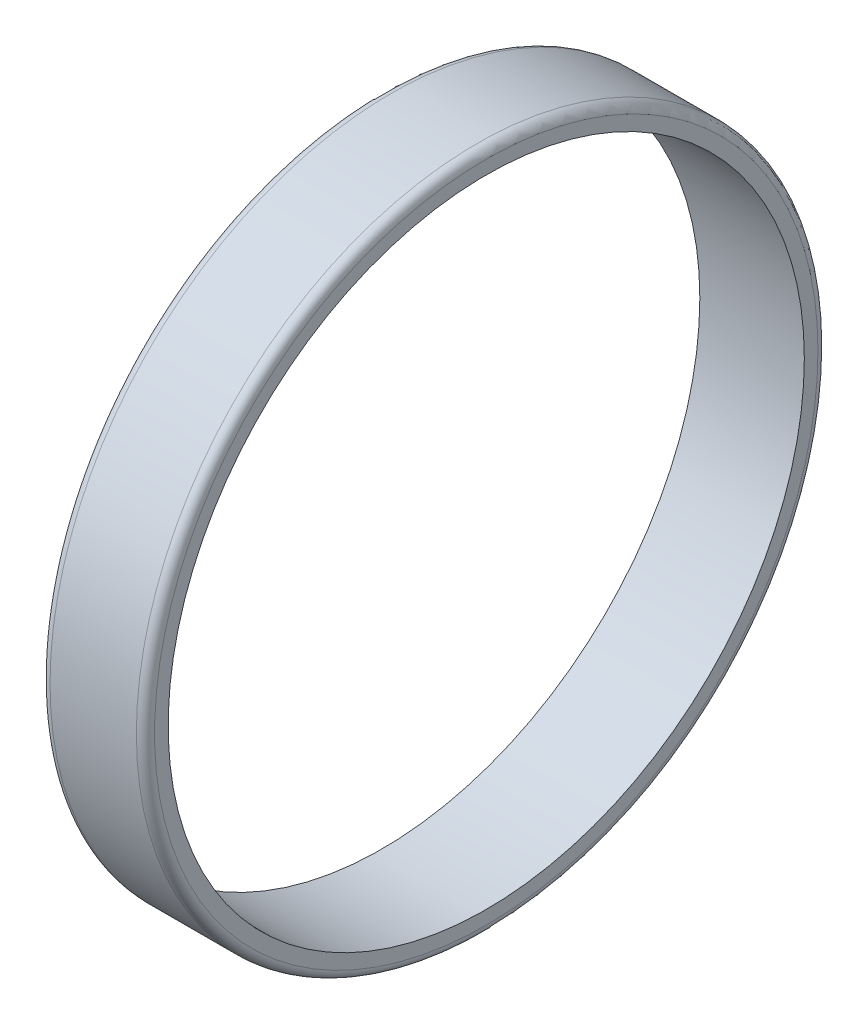
ISO-10303-21;
HEADER;
FILE_DESCRIPTION(('STEP AP214'),'2;1');
FILE_NAME('part.step','',(''),(''),'','','');
FILE_SCHEMA(('AUTOMOTIVE_DESIGN { 1 0 10303 214 1 1 1 1 }'));
ENDSEC;
DATA;
#1=APPLICATION_CONTEXT('core data for automotive mechanical design processes');
#2=APPLICATION_PROTOCOL_DEFINITION('international standard','automotive_design',2000,#1);
#3=PRODUCT_CONTEXT('',#1,'mechanical');
#4=PRODUCT('Part','Part','',(#3));
#5=PRODUCT_RELATED_PRODUCT_CATEGORY('part','',(#4));
#6=PRODUCT_DEFINITION_FORMATION('','',#4);
#7=PRODUCT_DEFINITION_CONTEXT('part definition',#1,'design');
#8=PRODUCT_DEFINITION('design','',#6,#7);
#9=PRODUCT_DEFINITION_SHAPE('','',#8);
#10=(LENGTH_UNIT() NAMED_UNIT(*) SI_UNIT(.MILLI.,.METRE.));
#11=(NAMED_UNIT(*) PLANE_ANGLE_UNIT() SI_UNIT($,.RADIAN.));
#12=(NAMED_UNIT(*) SI_UNIT($,.STERADIAN.) SOLID_ANGLE_UNIT());
#13=UNCERTAINTY_MEASURE_WITH_UNIT(LENGTH_MEASURE(1.E-05),#10,'distance_accuracy_value','');
#14=(GEOMETRIC_REPRESENTATION_CONTEXT(3) GLOBAL_UNCERTAINTY_ASSIGNED_CONTEXT((#13)) GLOBAL_UNIT_ASSIGNED_CONTEXT((#10,
#11,#12)) REPRESENTATION_CONTEXT('',''));
#15=CARTESIAN_POINT('',(0.,0.,0.));
#16=DIRECTION('',(0.,0.,1.));
#17=DIRECTION('',(1.,0.,0.));
#18=AXIS2_PLACEMENT_3D('',#15,#16,#17);
#19=CARTESIAN_POINT('',(11.5,0.,0.));
#20=DIRECTION('',(1.,0.,0.));
#21=DIRECTION('',(0.,0.,-1.));
#22=AXIS2_PLACEMENT_3D('',#19,#20,#21);
#23=PLANE('',#22);
#24=CARTESIAN_POINT('',(11.5,0.,0.));
#25=DIRECTION('',(1.,0.,0.));
#26=DIRECTION('',(0.,0.,-1.));
#27=AXIS2_PLACEMENT_3D('',#24,#25,#26);
#28=CIRCLE('',#27,36.5);
#29=CARTESIAN_POINT('',(11.5,0.,-36.5));
#30=VERTEX_POINT('',#29);
#31=EDGE_CURVE('E10',#30,#30,#28,.T.);
#32=ORIENTED_EDGE('',*,*,#31,.T.);
#33=EDGE_LOOP('',(#32));
#34=FACE_BOUND('',#33,.T.);
#35=CARTESIAN_POINT('',(11.5,0.,0.));
#36=DIRECTION('',(1.,0.,0.));
#37=DIRECTION('',(0.,0.,-1.));
#38=AXIS2_PLACEMENT_3D('',#35,#36,#37);
#39=CIRCLE('',#38,35.);
#40=CARTESIAN_POINT('',(11.5,0.,-35.));
#41=VERTEX_POINT('',#40);
#42=EDGE_CURVE('E53',#41,#41,#39,.T.);
#43=ORIENTED_EDGE('',*,*,#42,.F.);
#44=EDGE_LOOP('',(#43));
#45=FACE_BOUND('',#44,.T.);
#46=ADVANCED_FACE('F33',(#34,#45),#23,.T.);
#47=CARTESIAN_POINT('',(0.,0.,0.));
#48=DIRECTION('',(1.,0.,0.));
#49=DIRECTION('',(0.,0.,-1.));
#50=AXIS2_PLACEMENT_3D('',#47,#48,#49);
#51=PLANE('',#50);
#52=CARTESIAN_POINT('',(0.,0.,0.));
#53=DIRECTION('',(1.,0.,0.));
#54=DIRECTION('',(0.,0.,-1.));
#55=AXIS2_PLACEMENT_3D('',#52,#53,#54);
#56=CIRCLE('',#55,36.5);
#57=CARTESIAN_POINT('',(0.,0.,-36.5));
#58=VERTEX_POINT('',#57);
#59=EDGE_CURVE('E40',#58,#58,#56,.F.);
#60=ORIENTED_EDGE('',*,*,#59,.T.);
#61=EDGE_LOOP('',(#60));
#62=FACE_BOUND('',#61,.T.);
#63=CARTESIAN_POINT('',(0.,0.,0.));
#64=DIRECTION('',(1.,0.,0.));
#65=DIRECTION('',(0.,0.,-1.));
#66=AXIS2_PLACEMENT_3D('',#63,#64,#65);
#67=CIRCLE('',#66,35.);
#68=CARTESIAN_POINT('',(0.,0.,-35.));
#69=VERTEX_POINT('',#68);
#70=EDGE_CURVE('E54',#69,#69,#67,.T.);
#71=ORIENTED_EDGE('',*,*,#70,.T.);
#72=EDGE_LOOP('',(#71));
#73=FACE_BOUND('',#72,.T.);
#74=ADVANCED_FACE('F64',(#62,#73),#51,.F.);
#75=CARTESIAN_POINT('',(11.5,0.,0.));
#76=DIRECTION('',(-1.,0.,0.));
#77=DIRECTION('',(0.,0.,1.));
#78=AXIS2_PLACEMENT_3D('',#75,#76,#77);
#79=CYLINDRICAL_SURFACE('',#78,37.5);
#80=CARTESIAN_POINT('',(1.,0.,0.));
#81=DIRECTION('',(1.,0.,0.));
#82=DIRECTION('',(0.,0.,-1.));
#83=AXIS2_PLACEMENT_3D('',#80,#81,#82);
#84=CIRCLE('',#83,37.5);
#85=CARTESIAN_POINT('',(1.,0.,-37.5));
#86=VERTEX_POINT('',#85);
#87=EDGE_CURVE('E44',#86,#86,#84,.T.);
#88=ORIENTED_EDGE('',*,*,#87,.T.);
#89=EDGE_LOOP('',(#88));
#90=FACE_BOUND('',#89,.T.);
#91=CARTESIAN_POINT('',(10.5,0.,0.));
#92=DIRECTION('',(1.,0.,0.));
#93=DIRECTION('',(0.,0.,-1.));
#94=AXIS2_PLACEMENT_3D('',#91,#92,#93);
#95=CIRCLE('',#94,37.5);
#96=CARTESIAN_POINT('',(10.5,0.,-37.5));
#97=VERTEX_POINT('',#96);
#98=EDGE_CURVE('E48',#97,#97,#95,.F.);
#99=ORIENTED_EDGE('',*,*,#98,.T.);
#100=EDGE_LOOP('',(#99));
#101=FACE_BOUND('',#100,.T.);
#102=ADVANCED_FACE('F69',(#90,#101),#79,.T.);
#103=CARTESIAN_POINT('',(11.5,0.,0.));
#104=DIRECTION('',(-1.,0.,0.));
#105=DIRECTION('',(0.,0.,1.));
#106=AXIS2_PLACEMENT_3D('',#103,#104,#105);
#107=CYLINDRICAL_SURFACE('',#106,35.);
#108=ORIENTED_EDGE('',*,*,#42,.T.);
#109=EDGE_LOOP('',(#108));
#110=FACE_BOUND('',#109,.T.);
#111=ORIENTED_EDGE('',*,*,#70,.F.);
#112=EDGE_LOOP('',(#111));
#113=FACE_BOUND('',#112,.T.);
#114=ADVANCED_FACE('F60',(#110,#113),#107,.F.);
#115=CARTESIAN_POINT('',(1.,0.,0.));
#116=DIRECTION('',(1.,0.,0.));
#117=DIRECTION('',(0.,0.,-1.));
#118=AXIS2_PLACEMENT_3D('',#115,#116,#117);
#119=TOROIDAL_SURFACE('',#118,36.5,1.);
#120=ORIENTED_EDGE('',*,*,#59,.F.);
#121=EDGE_LOOP('',(#120));
#122=FACE_BOUND('',#121,.T.);
#123=ORIENTED_EDGE('',*,*,#87,.F.);
#124=EDGE_LOOP('',(#123));
#125=FACE_BOUND('',#124,.T.);
#126=ADVANCED_FACE('F75',(#122,#125),#119,.T.);
#127=CARTESIAN_POINT('',(10.5,0.,0.));
#128=DIRECTION('',(1.,0.,0.));
#129=DIRECTION('',(0.,0.,-1.));
#130=AXIS2_PLACEMENT_3D('',#127,#128,#129);
#131=TOROIDAL_SURFACE('',#130,36.5,1.);
#132=ORIENTED_EDGE('',*,*,#98,.F.);
#133=EDGE_LOOP('',(#132));
#134=FACE_BOUND('',#133,.T.);
#135=ORIENTED_EDGE('',*,*,#31,.F.);
#136=EDGE_LOOP('',(#135));
#137=FACE_BOUND('',#136,.T.);
#138=ADVANCED_FACE('F35',(#134,#137),#131,.T.);
#139=CLOSED_SHELL('',(#46,#74,#102,#114,#126,#138));
#140=MANIFOLD_SOLID_BREP('B2',#139);
#141=ADVANCED_BREP_SHAPE_REPRESENTATION('',(#18,#140),#14);
#142=SHAPE_DEFINITION_REPRESENTATION(#9,#141);
ENDSEC;
END-ISO-10303-21;
